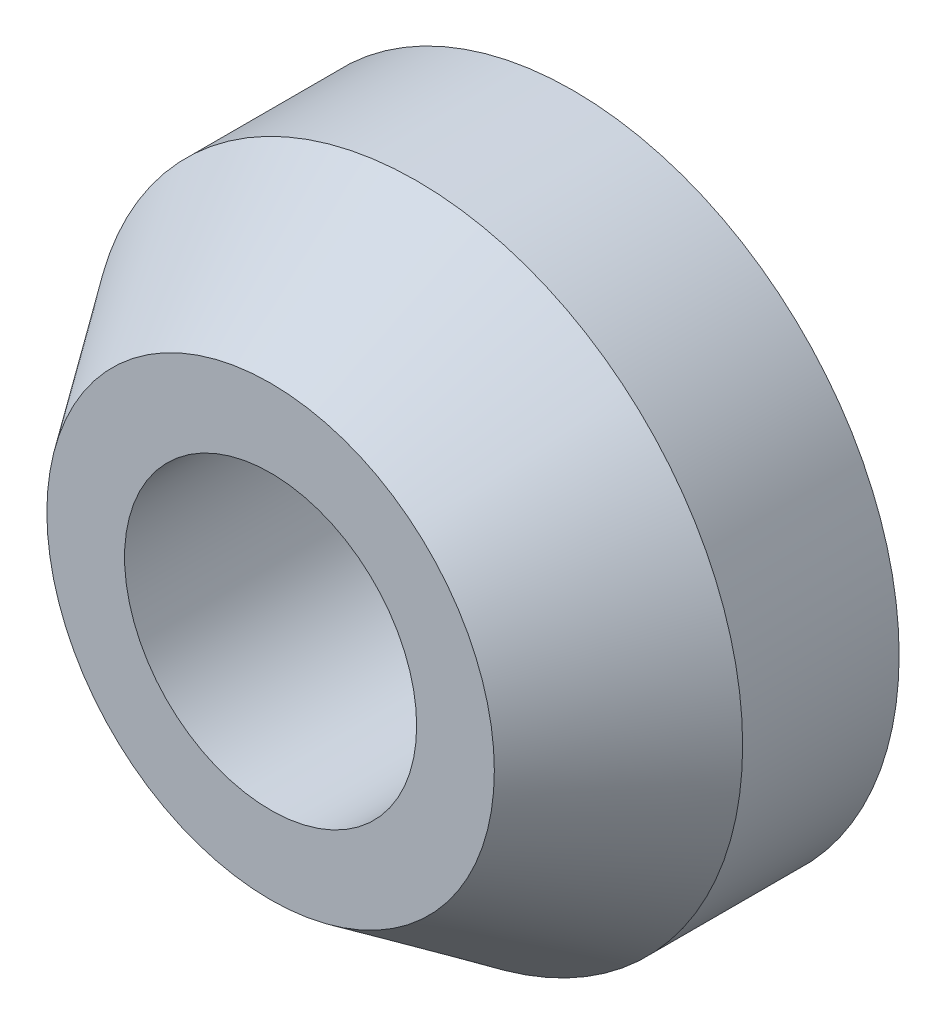
ISO-10303-21;
HEADER;
FILE_DESCRIPTION(('STEP AP214'),'2;1');
FILE_NAME('part.step','',(''),(''),'','','');
FILE_SCHEMA(('AUTOMOTIVE_DESIGN { 1 0 10303 214 1 1 1 1 }'));
ENDSEC;
DATA;
#1=APPLICATION_CONTEXT('core data for automotive mechanical design processes');
#2=APPLICATION_PROTOCOL_DEFINITION('international standard','automotive_design',2000,#1);
#3=PRODUCT_CONTEXT('',#1,'mechanical');
#4=PRODUCT('Part','Part','',(#3));
#5=PRODUCT_RELATED_PRODUCT_CATEGORY('part','',(#4));
#6=PRODUCT_DEFINITION_FORMATION('','',#4);
#7=PRODUCT_DEFINITION_CONTEXT('part definition',#1,'design');
#8=PRODUCT_DEFINITION('design','',#6,#7);
#9=PRODUCT_DEFINITION_SHAPE('','',#8);
#10=(LENGTH_UNIT() NAMED_UNIT(*) SI_UNIT(.MILLI.,.METRE.));
#11=(NAMED_UNIT(*) PLANE_ANGLE_UNIT() SI_UNIT($,.RADIAN.));
#12=(NAMED_UNIT(*) SI_UNIT($,.STERADIAN.) SOLID_ANGLE_UNIT());
#13=UNCERTAINTY_MEASURE_WITH_UNIT(LENGTH_MEASURE(1.E-05),#10,'distance_accuracy_value','');
#14=(GEOMETRIC_REPRESENTATION_CONTEXT(3) GLOBAL_UNCERTAINTY_ASSIGNED_CONTEXT((#13)) GLOBAL_UNIT_ASSIGNED_CONTEXT((#10,
#11,#12)) REPRESENTATION_CONTEXT('',''));
#15=CARTESIAN_POINT('',(0.,0.,0.));
#16=DIRECTION('',(0.,0.,1.));
#17=DIRECTION('',(1.,0.,0.));
#18=AXIS2_PLACEMENT_3D('',#15,#16,#17);
#19=CARTESIAN_POINT('',(0.,0.,2.9464));
#20=DIRECTION('',(0.,0.,-1.));
#21=DIRECTION('',(-1.,0.,0.));
#22=AXIS2_PLACEMENT_3D('',#19,#20,#21);
#23=CYLINDRICAL_SURFACE('',#22,3.175);
#24=CARTESIAN_POINT('',(0.,0.,1.52399999999999));
#25=DIRECTION('',(0.,0.,1.));
#26=DIRECTION('',(1.,0.,0.));
#27=AXIS2_PLACEMENT_3D('',#24,#25,#26);
#28=CIRCLE('',#27,3.175);
#29=CARTESIAN_POINT('',(3.175,0.,1.52399999999999));
#30=VERTEX_POINT('',#29);
#31=EDGE_CURVE('E10',#30,#30,#28,.F.);
#32=ORIENTED_EDGE('',*,*,#31,.T.);
#33=EDGE_LOOP('',(#32));
#34=FACE_BOUND('',#33,.T.);
#35=CARTESIAN_POINT('',(0.,0.,0.));
#36=DIRECTION('',(0.,0.,1.));
#37=DIRECTION('',(1.,0.,0.));
#38=AXIS2_PLACEMENT_3D('',#35,#36,#37);
#39=CIRCLE('',#38,3.175);
#40=CARTESIAN_POINT('',(3.175,0.,0.));
#41=VERTEX_POINT('',#40);
#42=EDGE_CURVE('E40',#41,#41,#39,.T.);
#43=ORIENTED_EDGE('',*,*,#42,.T.);
#44=EDGE_LOOP('',(#43));
#45=FACE_BOUND('',#44,.T.);
#46=ADVANCED_FACE('F29',(#34,#45),#23,.T.);
#47=CARTESIAN_POINT('',(0.,0.,2.9464));
#48=DIRECTION('',(0.,0.,1.));
#49=DIRECTION('',(1.,0.,0.));
#50=AXIS2_PLACEMENT_3D('',#47,#48,#49);
#51=PLANE('',#50);
#52=CARTESIAN_POINT('',(0.,0.,2.9464));
#53=DIRECTION('',(0.,0.,1.));
#54=DIRECTION('',(1.,0.,0.));
#55=AXIS2_PLACEMENT_3D('',#52,#53,#54);
#56=CIRCLE('',#55,2.17902479765051);
#57=CARTESIAN_POINT('',(2.17902479765051,0.,2.9464));
#58=VERTEX_POINT('',#57);
#59=EDGE_CURVE('E36',#58,#58,#56,.T.);
#60=ORIENTED_EDGE('',*,*,#59,.T.);
#61=EDGE_LOOP('',(#60));
#62=FACE_BOUND('',#61,.T.);
#63=CARTESIAN_POINT('',(0.,0.,2.9464));
#64=DIRECTION('',(0.,0.,1.));
#65=DIRECTION('',(1.,0.,0.));
#66=AXIS2_PLACEMENT_3D('',#63,#64,#65);
#67=CIRCLE('',#66,1.4224);
#68=CARTESIAN_POINT('',(1.4224,0.,2.9464));
#69=VERTEX_POINT('',#68);
#70=EDGE_CURVE('E47',#69,#69,#67,.T.);
#71=ORIENTED_EDGE('',*,*,#70,.F.);
#72=EDGE_LOOP('',(#71));
#73=FACE_BOUND('',#72,.T.);
#74=ADVANCED_FACE('F62',(#62,#73),#51,.T.);
#75=CARTESIAN_POINT('',(0.,0.,0.));
#76=DIRECTION('',(0.,0.,1.));
#77=DIRECTION('',(1.,0.,0.));
#78=AXIS2_PLACEMENT_3D('',#75,#76,#77);
#79=PLANE('',#78);
#80=CARTESIAN_POINT('',(0.,0.,0.));
#81=DIRECTION('',(0.,0.,1.));
#82=DIRECTION('',(1.,0.,0.));
#83=AXIS2_PLACEMENT_3D('',#80,#81,#82);
#84=CIRCLE('',#83,1.4224);
#85=CARTESIAN_POINT('',(1.4224,0.,0.));
#86=VERTEX_POINT('',#85);
#87=EDGE_CURVE('E44',#86,#86,#84,.T.);
#88=ORIENTED_EDGE('',*,*,#87,.T.);
#89=EDGE_LOOP('',(#88));
#90=FACE_BOUND('',#89,.T.);
#91=ORIENTED_EDGE('',*,*,#42,.F.);
#92=EDGE_LOOP('',(#91));
#93=FACE_BOUND('',#92,.T.);
#94=ADVANCED_FACE('F53',(#90,#93),#79,.F.);
#95=CARTESIAN_POINT('',(0.,0.,0.));
#96=DIRECTION('',(0.,0.,1.));
#97=DIRECTION('',(1.,0.,0.));
#98=AXIS2_PLACEMENT_3D('',#95,#96,#97);
#99=CYLINDRICAL_SURFACE('',#98,1.4224);
#100=ORIENTED_EDGE('',*,*,#87,.F.);
#101=EDGE_LOOP('',(#100));
#102=FACE_BOUND('',#101,.T.);
#103=ORIENTED_EDGE('',*,*,#70,.T.);
#104=EDGE_LOOP('',(#103));
#105=FACE_BOUND('',#104,.T.);
#106=ADVANCED_FACE('F56',(#102,#105),#99,.F.);
#107=CARTESIAN_POINT('',(0.,0.,2.9464));
#108=DIRECTION('',(0.,0.,-1.));
#109=DIRECTION('',(-1.,0.,0.));
#110=AXIS2_PLACEMENT_3D('',#107,#108,#109);
#111=CONICAL_SURFACE('',#110,2.17902479765051,0.610865238198013);
#112=ORIENTED_EDGE('',*,*,#31,.F.);
#113=EDGE_LOOP('',(#112));
#114=FACE_BOUND('',#113,.T.);
#115=ORIENTED_EDGE('',*,*,#59,.F.);
#116=EDGE_LOOP('',(#115));
#117=FACE_BOUND('',#116,.T.);
#118=ADVANCED_FACE('F31',(#114,#117),#111,.T.);
#119=CLOSED_SHELL('',(#46,#74,#94,#106,#118));
#120=MANIFOLD_SOLID_BREP('B2',#119);
#121=ADVANCED_BREP_SHAPE_REPRESENTATION('',(#18,#120),#14);
#122=SHAPE_DEFINITION_REPRESENTATION(#9,#121);
ENDSEC;
END-ISO-10303-21;
